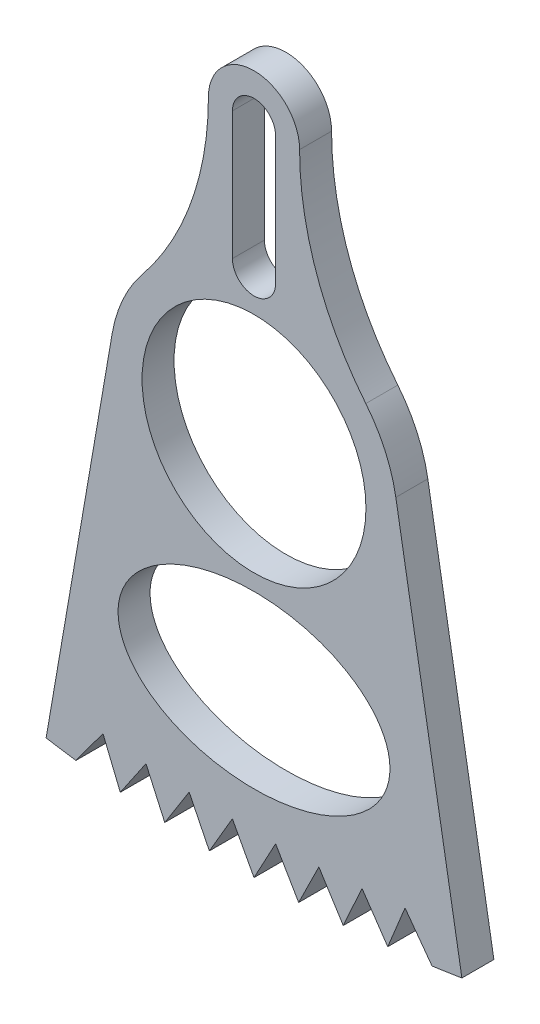
ISO-10303-21;
HEADER;
FILE_DESCRIPTION(('STEP AP214'),'2;1');
FILE_NAME('part.step','',(''),(''),'','','');
FILE_SCHEMA(('AUTOMOTIVE_DESIGN { 1 0 10303 214 1 1 1 1 }'));
ENDSEC;
DATA;
#1=APPLICATION_CONTEXT('core data for automotive mechanical design processes');
#2=APPLICATION_PROTOCOL_DEFINITION('international standard','automotive_design',2000,#1);
#3=PRODUCT_CONTEXT('',#1,'mechanical');
#4=PRODUCT('Part','Part','',(#3));
#5=PRODUCT_RELATED_PRODUCT_CATEGORY('part','',(#4));
#6=PRODUCT_DEFINITION_FORMATION('','',#4);
#7=PRODUCT_DEFINITION_CONTEXT('part definition',#1,'design');
#8=PRODUCT_DEFINITION('design','',#6,#7);
#9=PRODUCT_DEFINITION_SHAPE('','',#8);
#10=(LENGTH_UNIT() NAMED_UNIT(*) SI_UNIT(.MILLI.,.METRE.));
#11=(NAMED_UNIT(*) PLANE_ANGLE_UNIT() SI_UNIT($,.RADIAN.));
#12=(NAMED_UNIT(*) SI_UNIT($,.STERADIAN.) SOLID_ANGLE_UNIT());
#13=UNCERTAINTY_MEASURE_WITH_UNIT(LENGTH_MEASURE(1.E-05),#10,'distance_accuracy_value','');
#14=(GEOMETRIC_REPRESENTATION_CONTEXT(3) GLOBAL_UNCERTAINTY_ASSIGNED_CONTEXT((#13)) GLOBAL_UNIT_ASSIGNED_CONTEXT((#10,
#11,#12)) REPRESENTATION_CONTEXT('',''));
#15=CARTESIAN_POINT('',(0.,0.,0.));
#16=DIRECTION('',(0.,0.,1.));
#17=DIRECTION('',(1.,0.,0.));
#18=AXIS2_PLACEMENT_3D('',#15,#16,#17);
#19=CARTESIAN_POINT('',(0.,56.5,-1.));
#20=DIRECTION('',(0.,0.,1.));
#21=DIRECTION('',(1.,0.,0.));
#22=AXIS2_PLACEMENT_3D('',#19,#20,#21);
#23=CYLINDRICAL_SURFACE('',#22,80.);
#24=DIRECTION('',(0.,0.,1.));
#25=VECTOR('',#24,1.);
#26=CARTESIAN_POINT('',(11.1338480768054,-22.7214454993256,-1.));
#27=LINE('',#26,#25);
#28=CARTESIAN_POINT('',(11.1338480768054,-22.7214454993256,-1.));
#29=VERTEX_POINT('',#28);
#30=CARTESIAN_POINT('',(11.1338480768054,-22.7214454993256,1.));
#31=VERTEX_POINT('',#30);
#32=EDGE_CURVE('E384',#29,#31,#27,.T.);
#33=ORIENTED_EDGE('',*,*,#32,.F.);
#34=CARTESIAN_POINT('',(0.,56.5,-1.));
#35=DIRECTION('',(0.,0.,1.));
#36=DIRECTION('',(1.,0.,0.));
#37=AXIS2_PLACEMENT_3D('',#34,#35,#36);
#38=CIRCLE('',#37,80.);
#39=CARTESIAN_POINT('',(13.,-22.4366834874635,-1.));
#40=VERTEX_POINT('',#39);
#41=EDGE_CURVE('E545',#29,#40,#38,.T.);
#42=ORIENTED_EDGE('',*,*,#41,.T.);
#43=DIRECTION('',(0.,0.,1.));
#44=VECTOR('',#43,1.);
#45=CARTESIAN_POINT('',(13.,-22.4366834874635,-1.));
#46=LINE('',#45,#44);
#47=CARTESIAN_POINT('',(13.,-22.4366834874635,1.));
#48=VERTEX_POINT('',#47);
#49=EDGE_CURVE('E155',#40,#48,#46,.T.);
#50=ORIENTED_EDGE('',*,*,#49,.T.);
#51=CARTESIAN_POINT('',(0.,56.5,1.));
#52=DIRECTION('',(0.,0.,1.));
#53=DIRECTION('',(1.,0.,0.));
#54=AXIS2_PLACEMENT_3D('',#51,#52,#53);
#55=CIRCLE('',#54,80.);
#56=EDGE_CURVE('E583',#31,#48,#55,.T.);
#57=ORIENTED_EDGE('',*,*,#56,.F.);
#58=EDGE_LOOP('',(#33,#42,#50,#57));
#59=FACE_BOUND('',#58,.T.);
#60=ADVANCED_FACE('F151',(#59),#23,.T.);
#61=CARTESIAN_POINT('',(0.,56.5,-1.));
#62=DIRECTION('',(0.,0.,1.));
#63=DIRECTION('',(1.,0.,0.));
#64=AXIS2_PLACEMENT_3D('',#61,#62,#63);
#65=PLANE('',#64);
#66=CARTESIAN_POINT('',(0.,-13.35,-1.));
#67=DIRECTION('',(0.,0.,1.));
#68=DIRECTION('',(-1.,0.,0.));
#69=AXIS2_PLACEMENT_3D('',#66,#67,#68);
#70=ELLIPSE('',#69,8.5,5.35);
#71=CARTESIAN_POINT('',(-8.5,-13.35,-1.));
#72=VERTEX_POINT('',#71);
#73=EDGE_CURVE('E455',#72,#72,#70,.T.);
#74=ORIENTED_EDGE('',*,*,#73,.T.);
#75=EDGE_LOOP('',(#74));
#76=FACE_BOUND('',#75,.T.);
#77=DIRECTION('',(0.,-1.,0.));
#78=VECTOR('',#77,1.);
#79=CARTESIAN_POINT('',(-1.35,9.35,-1.));
#80=LINE('',#79,#78);
#81=CARTESIAN_POINT('',(-1.35,17.35,-1.));
#82=VERTEX_POINT('',#81);
#83=CARTESIAN_POINT('',(-1.35,9.35,-1.));
#84=VERTEX_POINT('',#83);
#85=EDGE_CURVE('E652',#82,#84,#80,.T.);
#86=ORIENTED_EDGE('',*,*,#85,.T.);
#87=CARTESIAN_POINT('',(0.,9.35,-1.));
#88=DIRECTION('',(0.,0.,1.));
#89=DIRECTION('',(1.,0.,0.));
#90=AXIS2_PLACEMENT_3D('',#87,#88,#89);
#91=CIRCLE('',#90,1.35);
#92=CARTESIAN_POINT('',(1.35,9.35,-1.));
#93=VERTEX_POINT('',#92);
#94=EDGE_CURVE('E664',#84,#93,#91,.T.);
#95=ORIENTED_EDGE('',*,*,#94,.T.);
#96=DIRECTION('',(0.,1.,0.));
#97=VECTOR('',#96,1.);
#98=CARTESIAN_POINT('',(1.35,9.35,-1.));
#99=LINE('',#98,#97);
#100=CARTESIAN_POINT('',(1.35,17.35,-1.));
#101=VERTEX_POINT('',#100);
#102=EDGE_CURVE('E682',#93,#101,#99,.T.);
#103=ORIENTED_EDGE('',*,*,#102,.T.);
#104=CARTESIAN_POINT('',(0.,17.35,-1.));
#105=DIRECTION('',(0.,0.,1.));
#106=DIRECTION('',(1.,0.,0.));
#107=AXIS2_PLACEMENT_3D('',#104,#105,#106);
#108=CIRCLE('',#107,1.35);
#109=EDGE_CURVE('E678',#101,#82,#108,.T.);
#110=ORIENTED_EDGE('',*,*,#109,.T.);
#111=EDGE_LOOP('',(#86,#95,#103,#110));
#112=FACE_BOUND('',#111,.T.);
#113=CARTESIAN_POINT('',(0.,0.,-1.));
#114=DIRECTION('',(0.,0.,1.));
#115=DIRECTION('',(1.,0.,0.));
#116=AXIS2_PLACEMENT_3D('',#113,#114,#115);
#117=CIRCLE('',#116,7.);
#118=CARTESIAN_POINT('',(7.,0.,-1.));
#119=VERTEX_POINT('',#118);
#120=EDGE_CURVE('E638',#119,#119,#117,.T.);
#121=ORIENTED_EDGE('',*,*,#120,.T.);
#122=EDGE_LOOP('',(#121));
#123=FACE_BOUND('',#122,.T.);
#124=DIRECTION('',(-0.50449643035438,0.863413777837537,0.));
#125=VECTOR('',#124,1.);
#126=CARTESIAN_POINT('',(-8.13375803337397,-4.75259023950339,-1.));
#127=LINE('',#126,#125);
#128=CARTESIAN_POINT('',(2.79195973620008,-23.4512661615276,-1.));
#129=VERTEX_POINT('',#128);
#130=CARTESIAN_POINT('',(1.35255485266214,-20.9878156125113,-1.));
#131=VERTEX_POINT('',#130);
#132=EDGE_CURVE('E365',#129,#131,#127,.T.);
#133=ORIENTED_EDGE('',*,*,#132,.T.);
#134=DIRECTION('',(-0.474056398467513,-0.880494481000313,0.));
#135=VECTOR('',#134,1.);
#136=CARTESIAN_POINT('',(9.80899499953797,-5.28114251980776,-1.));
#137=LINE('',#136,#135);
#138=CARTESIAN_POINT('',(0.,-23.5,-1.));
#139=VERTEX_POINT('',#138);
#140=EDGE_CURVE('E348',#131,#139,#137,.T.);
#141=ORIENTED_EDGE('',*,*,#140,.T.);
#142=DIRECTION('',(0.474056398467513,-0.880494481000313,0.));
#143=VECTOR('',#142,1.);
#144=CARTESIAN_POINT('',(-9.80899499953797,-5.28114251980776,-1.));
#145=LINE('',#144,#143);
#146=CARTESIAN_POINT('',(-1.35255485266214,-20.9878156125113,-1.));
#147=VERTEX_POINT('',#146);
#148=EDGE_CURVE('E363',#147,#139,#145,.T.);
#149=ORIENTED_EDGE('',*,*,#148,.F.);
#150=DIRECTION('',(0.50449643035438,0.863413777837537,0.));
#151=VECTOR('',#150,1.);
#152=CARTESIAN_POINT('',(8.13375803337397,-4.75259023950339,-1.));
#153=LINE('',#152,#151);
#154=CARTESIAN_POINT('',(-2.79195973620008,-23.4512661615276,-1.));
#155=VERTEX_POINT('',#154);
#156=EDGE_CURVE('E372',#155,#147,#153,.T.);
#157=ORIENTED_EDGE('',*,*,#156,.F.);
#158=DIRECTION('',(0.44303880188191,-0.896502437267764,0.));
#159=VECTOR('',#158,1.);
#160=CARTESIAN_POINT('',(-11.5584441687212,-5.71201933564819,-1.));
#161=LINE('',#160,#159);
#162=CARTESIAN_POINT('',(-4.0560166782436,-20.8934086452704,-1.));
#163=VERTEX_POINT('',#162);
#164=EDGE_CURVE('E438',#163,#155,#161,.T.);
#165=ORIENTED_EDGE('',*,*,#164,.F.);
#166=DIRECTION('',(0.534321811052582,0.845281137985161,0.));
#167=VECTOR('',#166,1.);
#168=CARTESIAN_POINT('',(6.53852816719094,-4.13315529581013,-1.));
#169=LINE('',#168,#167);
#170=CARTESIAN_POINT('',(-5.58051789953006,-23.3051240207859,-1.));
#171=VERTEX_POINT('',#170);
#172=EDGE_CURVE('E435',#171,#163,#169,.T.);
#173=ORIENTED_EDGE('',*,*,#172,.F.);
#174=DIRECTION('',(0.411481430761094,-0.911418143411027,0.));
#175=VECTOR('',#174,1.);
#176=CARTESIAN_POINT('',(-13.3758004505805,-6.03882372407155,-1.));
#177=LINE('',#176,#175);
#178=CARTESIAN_POINT('',(-6.75453687228408,-20.704709731136,-1.));
#179=VERTEX_POINT('',#178);
#180=EDGE_CURVE('E391',#179,#171,#177,.T.);
#181=ORIENTED_EDGE('',*,*,#180,.F.);
#182=DIRECTION('',(0.563496202929981,0.826118653271728,0.));
#183=VECTOR('',#182,1.);
#184=CARTESIAN_POINT('',(5.02856475586009,-3.42998809540578,-1.));
#185=LINE('',#184,#183);
#186=CARTESIAN_POINT('',(-8.36227706141236,-23.0617516294619,-1.));
#187=VERTEX_POINT('',#186);
#188=EDGE_CURVE('E388',#187,#179,#185,.T.);
#189=ORIENTED_EDGE('',*,*,#188,.F.);
#190=DIRECTION('',(0.379422732900757,-0.925223426939743,0.));
#191=VECTOR('',#190,1.);
#192=CARTESIAN_POINT('',(-15.2542765768058,-6.25559096178462,-1.));
#193=LINE('',#192,#191);
#194=CARTESIAN_POINT('',(-9.44482770360232,-20.421948770668,-1.));
#195=VERTEX_POINT('',#194);
#196=EDGE_CURVE('E410',#195,#187,#193,.T.);
#197=ORIENTED_EDGE('',*,*,#196,.F.);
#198=DIRECTION('',(0.591984061484046,0.805949670233107,0.));
#199=VECTOR('',#198,1.);
#200=CARTESIAN_POINT('',(3.60856905014065,-2.65055677959397,-1.));
#201=LINE('',#200,#199);
#202=CARTESIAN_POINT('',(-11.1338480768054,-22.7214454993256,-1.));
#203=VERTEX_POINT('',#202);
#204=EDGE_CURVE('E407',#203,#195,#201,.T.);
#205=ORIENTED_EDGE('',*,*,#204,.F.);
#206=CARTESIAN_POINT('',(-13.,-22.4366834874635,-1.));
#207=VERTEX_POINT('',#206);
#208=EDGE_CURVE('E537',#207,#203,#38,.T.);
#209=ORIENTED_EDGE('',*,*,#208,.F.);
#210=DIRECTION('',(-0.169859659212207,-0.985468262387132,0.));
#211=VECTOR('',#210,1.);
#212=CARTESIAN_POINT('',(-13.,-22.4366834874635,-1.));
#213=LINE('',#212,#211);
#214=CARTESIAN_POINT('',(-8.86921436148419,1.52873693290986,-1.));
#215=VERTEX_POINT('',#214);
#216=EDGE_CURVE('E576',#215,#207,#213,.T.);
#217=ORIENTED_EDGE('',*,*,#216,.F.);
#218=CARTESIAN_POINT('',(0.,0.,-1.));
#219=DIRECTION('',(0.,0.,1.));
#220=DIRECTION('',(1.,0.,0.));
#221=AXIS2_PLACEMENT_3D('',#218,#219,#220);
#222=CIRCLE('',#221,9.00000000000009);
#223=CARTESIAN_POINT('',(-6.99080700615328,5.66821112898224,-1.));
#224=VERTEX_POINT('',#223);
#225=EDGE_CURVE('E572',#224,#215,#222,.T.);
#226=ORIENTED_EDGE('',*,*,#225,.F.);
#227=CARTESIAN_POINT('',(-21.3983739837403,17.3500000000002,-1.));
#228=DIRECTION('',(0.,0.,-1.));
#229=DIRECTION('',(-1.,0.,0.));
#230=AXIS2_PLACEMENT_3D('',#227,#228,#229);
#231=CIRCLE('',#230,18.5483739837403);
#232=CARTESIAN_POINT('',(-2.84999999999999,17.35,-1.));
#233=VERTEX_POINT('',#232);
#234=EDGE_CURVE('E568',#233,#224,#231,.T.);
#235=ORIENTED_EDGE('',*,*,#234,.F.);
#236=CARTESIAN_POINT('',(0.,17.35,-1.));
#237=DIRECTION('',(0.,0.,1.));
#238=DIRECTION('',(1.,0.,0.));
#239=AXIS2_PLACEMENT_3D('',#236,#237,#238);
#240=CIRCLE('',#239,2.85);
#241=CARTESIAN_POINT('',(2.85,17.35,-1.));
#242=VERTEX_POINT('',#241);
#243=EDGE_CURVE('E564',#242,#233,#240,.T.);
#244=ORIENTED_EDGE('',*,*,#243,.F.);
#245=CARTESIAN_POINT('',(21.3983739837402,17.3500000000002,-1.));
#246=DIRECTION('',(0.,0.,-1.));
#247=DIRECTION('',(1.,0.,0.));
#248=AXIS2_PLACEMENT_3D('',#245,#246,#247);
#249=CIRCLE('',#248,18.5483739837403);
#250=CARTESIAN_POINT('',(6.99080700615328,5.66821112898225,-1.));
#251=VERTEX_POINT('',#250);
#252=EDGE_CURVE('E560',#251,#242,#249,.T.);
#253=ORIENTED_EDGE('',*,*,#252,.F.);
#254=CARTESIAN_POINT('',(0.,0.,-1.));
#255=DIRECTION('',(0.,0.,1.));
#256=DIRECTION('',(-1.,0.,0.));
#257=AXIS2_PLACEMENT_3D('',#254,#255,#256);
#258=CIRCLE('',#257,8.99999999999993);
#259=CARTESIAN_POINT('',(8.8692143614842,1.52873693290987,-1.));
#260=VERTEX_POINT('',#259);
#261=EDGE_CURVE('E550',#260,#251,#258,.T.);
#262=ORIENTED_EDGE('',*,*,#261,.F.);
#263=DIRECTION('',(-0.169859659212207,0.985468262387132,0.));
#264=VECTOR('',#263,1.);
#265=CARTESIAN_POINT('',(13.,-22.4366834874635,-1.));
#266=LINE('',#265,#264);
#267=EDGE_CURVE('E544',#40,#260,#266,.T.);
#268=ORIENTED_EDGE('',*,*,#267,.F.);
#269=ORIENTED_EDGE('',*,*,#41,.F.);
#270=DIRECTION('',(-0.591984061484046,0.805949670233107,0.));
#271=VECTOR('',#270,1.);
#272=CARTESIAN_POINT('',(-3.60856905014065,-2.65055677959397,-1.));
#273=LINE('',#272,#271);
#274=CARTESIAN_POINT('',(9.44482770360232,-20.421948770668,-1.));
#275=VERTEX_POINT('',#274);
#276=EDGE_CURVE('E713',#29,#275,#273,.T.);
#277=ORIENTED_EDGE('',*,*,#276,.T.);
#278=DIRECTION('',(-0.379422732900757,-0.925223426939743,0.));
#279=VECTOR('',#278,1.);
#280=CARTESIAN_POINT('',(15.2542765768058,-6.25559096178462,-1.));
#281=LINE('',#280,#279);
#282=CARTESIAN_POINT('',(8.36227706141236,-23.0617516294619,-1.));
#283=VERTEX_POINT('',#282);
#284=EDGE_CURVE('E716',#275,#283,#281,.T.);
#285=ORIENTED_EDGE('',*,*,#284,.T.);
#286=DIRECTION('',(-0.563496202929981,0.826118653271728,0.));
#287=VECTOR('',#286,1.);
#288=CARTESIAN_POINT('',(-5.02856475586009,-3.42998809540578,-1.));
#289=LINE('',#288,#287);
#290=CARTESIAN_POINT('',(6.75453687228408,-20.704709731136,-1.));
#291=VERTEX_POINT('',#290);
#292=EDGE_CURVE('E762',#283,#291,#289,.T.);
#293=ORIENTED_EDGE('',*,*,#292,.T.);
#294=DIRECTION('',(-0.411481430761094,-0.911418143411027,0.));
#295=VECTOR('',#294,1.);
#296=CARTESIAN_POINT('',(13.3758004505805,-6.03882372407155,-1.));
#297=LINE('',#296,#295);
#298=CARTESIAN_POINT('',(5.58051789953006,-23.3051240207859,-1.));
#299=VERTEX_POINT('',#298);
#300=EDGE_CURVE('E766',#291,#299,#297,.T.);
#301=ORIENTED_EDGE('',*,*,#300,.T.);
#302=DIRECTION('',(-0.534321811052582,0.845281137985161,0.));
#303=VECTOR('',#302,1.);
#304=CARTESIAN_POINT('',(-6.53852816719094,-4.13315529581013,-1.));
#305=LINE('',#304,#303);
#306=CARTESIAN_POINT('',(4.0560166782436,-20.8934086452704,-1.));
#307=VERTEX_POINT('',#306);
#308=EDGE_CURVE('E727',#299,#307,#305,.T.);
#309=ORIENTED_EDGE('',*,*,#308,.T.);
#310=DIRECTION('',(-0.44303880188191,-0.896502437267764,0.));
#311=VECTOR('',#310,1.);
#312=CARTESIAN_POINT('',(11.5584441687212,-5.71201933564819,-1.));
#313=LINE('',#312,#311);
#314=EDGE_CURVE('E731',#307,#129,#313,.T.);
#315=ORIENTED_EDGE('',*,*,#314,.T.);
#316=EDGE_LOOP('',(#133,#141,#149,#157,#165,#173,#181,#189,#197,#205,#209,#217,#226,#235,#244,
#253,#262,#268,#269,#277,#285,#293,#301,#309,#315));
#317=FACE_BOUND('',#316,.T.);
#318=ADVANCED_FACE('F361',(#76,#112,#123,#317),#65,.F.);
#319=CARTESIAN_POINT('',(0.,56.5,1.));
#320=DIRECTION('',(0.,0.,1.));
#321=DIRECTION('',(1.,0.,0.));
#322=AXIS2_PLACEMENT_3D('',#319,#320,#321);
#323=PLANE('',#322);
#324=DIRECTION('',(-0.474056398467513,-0.880494481000313,0.));
#325=VECTOR('',#324,1.);
#326=CARTESIAN_POINT('',(9.80899499953797,-5.28114251980776,1.));
#327=LINE('',#326,#325);
#328=CARTESIAN_POINT('',(1.35255485266214,-20.9878156125113,1.));
#329=VERTEX_POINT('',#328);
#330=CARTESIAN_POINT('',(0.,-23.5,1.));
#331=VERTEX_POINT('',#330);
#332=EDGE_CURVE('E351',#329,#331,#327,.T.);
#333=ORIENTED_EDGE('',*,*,#332,.F.);
#334=DIRECTION('',(-0.50449643035438,0.863413777837537,0.));
#335=VECTOR('',#334,1.);
#336=CARTESIAN_POINT('',(-8.13375803337397,-4.75259023950339,1.));
#337=LINE('',#336,#335);
#338=CARTESIAN_POINT('',(2.79195973620008,-23.4512661615276,1.));
#339=VERTEX_POINT('',#338);
#340=EDGE_CURVE('E367',#339,#329,#337,.T.);
#341=ORIENTED_EDGE('',*,*,#340,.F.);
#342=DIRECTION('',(-0.44303880188191,-0.896502437267764,0.));
#343=VECTOR('',#342,1.);
#344=CARTESIAN_POINT('',(11.5584441687212,-5.71201933564819,1.));
#345=LINE('',#344,#343);
#346=CARTESIAN_POINT('',(4.0560166782436,-20.8934086452704,1.));
#347=VERTEX_POINT('',#346);
#348=EDGE_CURVE('E732',#347,#339,#345,.T.);
#349=ORIENTED_EDGE('',*,*,#348,.F.);
#350=DIRECTION('',(-0.534321811052582,0.845281137985161,0.));
#351=VECTOR('',#350,1.);
#352=CARTESIAN_POINT('',(-6.53852816719094,-4.13315529581013,1.));
#353=LINE('',#352,#351);
#354=CARTESIAN_POINT('',(5.58051789953006,-23.3051240207859,1.));
#355=VERTEX_POINT('',#354);
#356=EDGE_CURVE('E735',#355,#347,#353,.T.);
#357=ORIENTED_EDGE('',*,*,#356,.F.);
#358=DIRECTION('',(-0.411481430761094,-0.911418143411027,0.));
#359=VECTOR('',#358,1.);
#360=CARTESIAN_POINT('',(13.3758004505805,-6.03882372407155,1.));
#361=LINE('',#360,#359);
#362=CARTESIAN_POINT('',(6.75453687228408,-20.704709731136,1.));
#363=VERTEX_POINT('',#362);
#364=EDGE_CURVE('E767',#363,#355,#361,.T.);
#365=ORIENTED_EDGE('',*,*,#364,.F.);
#366=DIRECTION('',(-0.563496202929981,0.826118653271728,0.));
#367=VECTOR('',#366,1.);
#368=CARTESIAN_POINT('',(-5.02856475586009,-3.42998809540578,1.));
#369=LINE('',#368,#367);
#370=CARTESIAN_POINT('',(8.36227706141236,-23.0617516294619,1.));
#371=VERTEX_POINT('',#370);
#372=EDGE_CURVE('E761',#371,#363,#369,.T.);
#373=ORIENTED_EDGE('',*,*,#372,.F.);
#374=DIRECTION('',(-0.379422732900757,-0.925223426939743,0.));
#375=VECTOR('',#374,1.);
#376=CARTESIAN_POINT('',(15.2542765768058,-6.25559096178462,1.));
#377=LINE('',#376,#375);
#378=CARTESIAN_POINT('',(9.44482770360232,-20.421948770668,1.));
#379=VERTEX_POINT('',#378);
#380=EDGE_CURVE('E706',#379,#371,#377,.T.);
#381=ORIENTED_EDGE('',*,*,#380,.F.);
#382=DIRECTION('',(-0.591984061484046,0.805949670233107,0.));
#383=VECTOR('',#382,1.);
#384=CARTESIAN_POINT('',(-3.60856905014065,-2.65055677959397,1.));
#385=LINE('',#384,#383);
#386=EDGE_CURVE('E636',#31,#379,#385,.T.);
#387=ORIENTED_EDGE('',*,*,#386,.F.);
#388=ORIENTED_EDGE('',*,*,#56,.T.);
#389=DIRECTION('',(-0.169859659212207,0.985468262387132,0.));
#390=VECTOR('',#389,1.);
#391=CARTESIAN_POINT('',(13.,-22.4366834874635,1.));
#392=LINE('',#391,#390);
#393=CARTESIAN_POINT('',(8.8692143614842,1.52873693290987,1.));
#394=VERTEX_POINT('',#393);
#395=EDGE_CURVE('E582',#48,#394,#392,.T.);
#396=ORIENTED_EDGE('',*,*,#395,.T.);
#397=CARTESIAN_POINT('',(0.,0.,1.));
#398=DIRECTION('',(0.,0.,1.));
#399=DIRECTION('',(-1.,0.,0.));
#400=AXIS2_PLACEMENT_3D('',#397,#398,#399);
#401=CIRCLE('',#400,8.99999999999993);
#402=CARTESIAN_POINT('',(6.99080700615328,5.66821112898225,1.));
#403=VERTEX_POINT('',#402);
#404=EDGE_CURVE('E587',#394,#403,#401,.T.);
#405=ORIENTED_EDGE('',*,*,#404,.T.);
#406=CARTESIAN_POINT('',(21.3983739837402,17.3500000000002,1.));
#407=DIRECTION('',(0.,0.,-1.));
#408=DIRECTION('',(1.,0.,0.));
#409=AXIS2_PLACEMENT_3D('',#406,#407,#408);
#410=CIRCLE('',#409,18.5483739837403);
#411=CARTESIAN_POINT('',(2.85,17.35,1.));
#412=VERTEX_POINT('',#411);
#413=EDGE_CURVE('E591',#403,#412,#410,.T.);
#414=ORIENTED_EDGE('',*,*,#413,.T.);
#415=CARTESIAN_POINT('',(0.,17.35,1.));
#416=DIRECTION('',(0.,0.,1.));
#417=DIRECTION('',(1.,0.,0.));
#418=AXIS2_PLACEMENT_3D('',#415,#416,#417);
#419=CIRCLE('',#418,2.85);
#420=CARTESIAN_POINT('',(-2.84999999999999,17.35,1.));
#421=VERTEX_POINT('',#420);
#422=EDGE_CURVE('E595',#412,#421,#419,.T.);
#423=ORIENTED_EDGE('',*,*,#422,.T.);
#424=CARTESIAN_POINT('',(-21.3983739837403,17.3500000000002,1.));
#425=DIRECTION('',(0.,0.,-1.));
#426=DIRECTION('',(-1.,0.,0.));
#427=AXIS2_PLACEMENT_3D('',#424,#425,#426);
#428=CIRCLE('',#427,18.5483739837403);
#429=CARTESIAN_POINT('',(-6.99080700615328,5.66821112898224,1.));
#430=VERTEX_POINT('',#429);
#431=EDGE_CURVE('E599',#421,#430,#428,.T.);
#432=ORIENTED_EDGE('',*,*,#431,.T.);
#433=CARTESIAN_POINT('',(0.,0.,1.));
#434=DIRECTION('',(0.,0.,1.));
#435=DIRECTION('',(1.,0.,0.));
#436=AXIS2_PLACEMENT_3D('',#433,#434,#435);
#437=CIRCLE('',#436,9.00000000000009);
#438=CARTESIAN_POINT('',(-8.86921436148419,1.52873693290986,1.));
#439=VERTEX_POINT('',#438);
#440=EDGE_CURVE('E603',#430,#439,#437,.T.);
#441=ORIENTED_EDGE('',*,*,#440,.T.);
#442=DIRECTION('',(-0.169859659212207,-0.985468262387132,0.));
#443=VECTOR('',#442,1.);
#444=CARTESIAN_POINT('',(-13.,-22.4366834874635,1.));
#445=LINE('',#444,#443);
#446=CARTESIAN_POINT('',(-13.,-22.4366834874635,1.));
#447=VERTEX_POINT('',#446);
#448=EDGE_CURVE('E552',#439,#447,#445,.T.);
#449=ORIENTED_EDGE('',*,*,#448,.T.);
#450=CARTESIAN_POINT('',(-11.1338480768054,-22.7214454993256,1.));
#451=VERTEX_POINT('',#450);
#452=EDGE_CURVE('E579',#447,#451,#55,.T.);
#453=ORIENTED_EDGE('',*,*,#452,.T.);
#454=DIRECTION('',(0.591984061484046,0.805949670233107,0.));
#455=VECTOR('',#454,1.);
#456=CARTESIAN_POINT('',(3.60856905014065,-2.65055677959397,1.));
#457=LINE('',#456,#455);
#458=CARTESIAN_POINT('',(-9.44482770360232,-20.421948770668,1.));
#459=VERTEX_POINT('',#458);
#460=EDGE_CURVE('E416',#451,#459,#457,.T.);
#461=ORIENTED_EDGE('',*,*,#460,.T.);
#462=DIRECTION('',(0.379422732900757,-0.925223426939743,0.));
#463=VECTOR('',#462,1.);
#464=CARTESIAN_POINT('',(-15.2542765768058,-6.25559096178462,1.));
#465=LINE('',#464,#463);
#466=CARTESIAN_POINT('',(-8.36227706141236,-23.0617516294618,1.));
#467=VERTEX_POINT('',#466);
#468=EDGE_CURVE('E411',#459,#467,#465,.T.);
#469=ORIENTED_EDGE('',*,*,#468,.T.);
#470=DIRECTION('',(0.563496202929981,0.826118653271728,0.));
#471=VECTOR('',#470,1.);
#472=CARTESIAN_POINT('',(5.02856475586009,-3.42998809540578,1.));
#473=LINE('',#472,#471);
#474=CARTESIAN_POINT('',(-6.75453687228408,-20.704709731136,1.));
#475=VERTEX_POINT('',#474);
#476=EDGE_CURVE('E177',#467,#475,#473,.T.);
#477=ORIENTED_EDGE('',*,*,#476,.T.);
#478=DIRECTION('',(0.411481430761094,-0.911418143411027,0.));
#479=VECTOR('',#478,1.);
#480=CARTESIAN_POINT('',(-13.3758004505805,-6.03882372407155,1.));
#481=LINE('',#480,#479);
#482=CARTESIAN_POINT('',(-5.58051789953006,-23.3051240207859,1.));
#483=VERTEX_POINT('',#482);
#484=EDGE_CURVE('E392',#475,#483,#481,.T.);
#485=ORIENTED_EDGE('',*,*,#484,.T.);
#486=DIRECTION('',(0.534321811052582,0.845281137985161,0.));
#487=VECTOR('',#486,1.);
#488=CARTESIAN_POINT('',(6.53852816719094,-4.13315529581013,1.));
#489=LINE('',#488,#487);
#490=CARTESIAN_POINT('',(-4.0560166782436,-20.8934086452704,1.));
#491=VERTEX_POINT('',#490);
#492=EDGE_CURVE('E404',#483,#491,#489,.T.);
#493=ORIENTED_EDGE('',*,*,#492,.T.);
#494=DIRECTION('',(0.44303880188191,-0.896502437267764,0.));
#495=VECTOR('',#494,1.);
#496=CARTESIAN_POINT('',(-11.5584441687212,-5.71201933564819,1.));
#497=LINE('',#496,#495);
#498=CARTESIAN_POINT('',(-2.79195973620008,-23.4512661615277,1.));
#499=VERTEX_POINT('',#498);
#500=EDGE_CURVE('E439',#491,#499,#497,.T.);
#501=ORIENTED_EDGE('',*,*,#500,.T.);
#502=DIRECTION('',(0.50449643035438,0.863413777837537,0.));
#503=VECTOR('',#502,1.);
#504=CARTESIAN_POINT('',(8.13375803337397,-4.75259023950339,1.));
#505=LINE('',#504,#503);
#506=CARTESIAN_POINT('',(-1.35255485266214,-20.9878156125113,1.));
#507=VERTEX_POINT('',#506);
#508=EDGE_CURVE('E169',#499,#507,#505,.T.);
#509=ORIENTED_EDGE('',*,*,#508,.T.);
#510=DIRECTION('',(0.474056398467513,-0.880494481000313,0.));
#511=VECTOR('',#510,1.);
#512=CARTESIAN_POINT('',(-9.80899499953797,-5.28114251980776,1.));
#513=LINE('',#512,#511);
#514=EDGE_CURVE('E377',#507,#331,#513,.T.);
#515=ORIENTED_EDGE('',*,*,#514,.T.);
#516=EDGE_LOOP('',(#333,#341,#349,#357,#365,#373,#381,#387,#388,#396,#405,#414,#423,#432,#441,
#449,#453,#461,#469,#477,#485,#493,#501,#509,#515));
#517=FACE_BOUND('',#516,.T.);
#518=CARTESIAN_POINT('',(0.,-13.35,1.));
#519=DIRECTION('',(0.,0.,1.));
#520=DIRECTION('',(-1.,0.,0.));
#521=AXIS2_PLACEMENT_3D('',#518,#519,#520);
#522=ELLIPSE('',#521,8.5,5.35);
#523=CARTESIAN_POINT('',(-8.5,-13.35,1.));
#524=VERTEX_POINT('',#523);
#525=EDGE_CURVE('E428',#524,#524,#522,.T.);
#526=ORIENTED_EDGE('',*,*,#525,.F.);
#527=EDGE_LOOP('',(#526));
#528=FACE_BOUND('',#527,.T.);
#529=CARTESIAN_POINT('',(0.,9.35,1.));
#530=DIRECTION('',(0.,0.,1.));
#531=DIRECTION('',(1.,0.,0.));
#532=AXIS2_PLACEMENT_3D('',#529,#530,#531);
#533=CIRCLE('',#532,1.35);
#534=CARTESIAN_POINT('',(-1.35,9.35,1.));
#535=VERTEX_POINT('',#534);
#536=CARTESIAN_POINT('',(1.35,9.35,1.));
#537=VERTEX_POINT('',#536);
#538=EDGE_CURVE('E460',#535,#537,#533,.T.);
#539=ORIENTED_EDGE('',*,*,#538,.F.);
#540=DIRECTION('',(0.,-1.,0.));
#541=VECTOR('',#540,1.);
#542=CARTESIAN_POINT('',(-1.35,9.35,1.));
#543=LINE('',#542,#541);
#544=CARTESIAN_POINT('',(-1.35,17.35,1.));
#545=VERTEX_POINT('',#544);
#546=EDGE_CURVE('E660',#545,#535,#543,.T.);
#547=ORIENTED_EDGE('',*,*,#546,.F.);
#548=CARTESIAN_POINT('',(0.,17.35,1.));
#549=DIRECTION('',(0.,0.,1.));
#550=DIRECTION('',(1.,0.,0.));
#551=AXIS2_PLACEMENT_3D('',#548,#549,#550);
#552=CIRCLE('',#551,1.35);
#553=CARTESIAN_POINT('',(1.35,17.35,1.));
#554=VERTEX_POINT('',#553);
#555=EDGE_CURVE('E665',#554,#545,#552,.T.);
#556=ORIENTED_EDGE('',*,*,#555,.F.);
#557=DIRECTION('',(0.,1.,0.));
#558=VECTOR('',#557,1.);
#559=CARTESIAN_POINT('',(1.35,9.35,1.));
#560=LINE('',#559,#558);
#561=EDGE_CURVE('E669',#537,#554,#560,.T.);
#562=ORIENTED_EDGE('',*,*,#561,.F.);
#563=EDGE_LOOP('',(#539,#547,#556,#562));
#564=FACE_BOUND('',#563,.T.);
#565=CARTESIAN_POINT('',(0.,0.,1.));
#566=DIRECTION('',(0.,0.,1.));
#567=DIRECTION('',(1.,0.,0.));
#568=AXIS2_PLACEMENT_3D('',#565,#566,#567);
#569=CIRCLE('',#568,7.);
#570=CARTESIAN_POINT('',(7.,0.,1.));
#571=VERTEX_POINT('',#570);
#572=EDGE_CURVE('E554',#571,#571,#569,.T.);
#573=ORIENTED_EDGE('',*,*,#572,.F.);
#574=EDGE_LOOP('',(#573));
#575=FACE_BOUND('',#574,.T.);
#576=ADVANCED_FACE('F493',(#517,#528,#564,#575),#323,.T.);
#577=ORIENTED_EDGE('',*,*,#208,.T.);
#578=DIRECTION('',(0.,0.,1.));
#579=VECTOR('',#578,1.);
#580=CARTESIAN_POINT('',(-11.1338480768054,-22.7214454993256,-1.));
#581=LINE('',#580,#579);
#582=EDGE_CURVE('E415',#203,#451,#581,.T.);
#583=ORIENTED_EDGE('',*,*,#582,.T.);
#584=ORIENTED_EDGE('',*,*,#452,.F.);
#585=DIRECTION('',(0.,0.,1.));
#586=VECTOR('',#585,1.);
#587=CARTESIAN_POINT('',(-13.,-22.4366834874635,-1.));
#588=LINE('',#587,#586);
#589=EDGE_CURVE('E12',#207,#447,#588,.T.);
#590=ORIENTED_EDGE('',*,*,#589,.F.);
#591=EDGE_LOOP('',(#577,#583,#584,#590));
#592=FACE_BOUND('',#591,.T.);
#593=ADVANCED_FACE('F153',(#592),#23,.T.);
#594=CARTESIAN_POINT('',(-13.,-22.4366834874635,-1.));
#595=DIRECTION('',(-0.985468262387132,0.169859659212207,0.));
#596=DIRECTION('',(-0.169859659212207,-0.985468262387132,0.));
#597=AXIS2_PLACEMENT_3D('',#594,#595,#596);
#598=PLANE('',#597);
#599=ORIENTED_EDGE('',*,*,#448,.F.);
#600=DIRECTION('',(0.,0.,1.));
#601=VECTOR('',#600,1.);
#602=CARTESIAN_POINT('',(-8.86921436148419,1.52873693290986,-1.));
#603=LINE('',#602,#601);
#604=EDGE_CURVE('E161',#215,#439,#603,.T.);
#605=ORIENTED_EDGE('',*,*,#604,.F.);
#606=ORIENTED_EDGE('',*,*,#216,.T.);
#607=ORIENTED_EDGE('',*,*,#589,.T.);
#608=EDGE_LOOP('',(#599,#605,#606,#607));
#609=FACE_BOUND('',#608,.T.);
#610=ADVANCED_FACE('F498',(#609),#598,.T.);
#611=CARTESIAN_POINT('',(0.,0.,-1.));
#612=DIRECTION('',(0.,0.,1.));
#613=DIRECTION('',(1.,0.,0.));
#614=AXIS2_PLACEMENT_3D('',#611,#612,#613);
#615=CYLINDRICAL_SURFACE('',#614,9.00000000000009);
#616=ORIENTED_EDGE('',*,*,#440,.F.);
#617=DIRECTION('',(0.,0.,1.));
#618=VECTOR('',#617,1.);
#619=CARTESIAN_POINT('',(-6.99080700615328,5.66821112898224,-1.));
#620=LINE('',#619,#618);
#621=EDGE_CURVE('E612',#224,#430,#620,.T.);
#622=ORIENTED_EDGE('',*,*,#621,.F.);
#623=ORIENTED_EDGE('',*,*,#225,.T.);
#624=ORIENTED_EDGE('',*,*,#604,.T.);
#625=EDGE_LOOP('',(#616,#622,#623,#624));
#626=FACE_BOUND('',#625,.T.);
#627=ADVANCED_FACE('F501',(#626),#615,.T.);
#628=CARTESIAN_POINT('',(-21.3983739837403,17.3500000000002,-1.));
#629=DIRECTION('',(0.,0.,1.));
#630=DIRECTION('',(1.,0.,0.));
#631=AXIS2_PLACEMENT_3D('',#628,#629,#630);
#632=CYLINDRICAL_SURFACE('',#631,18.5483739837403);
#633=ORIENTED_EDGE('',*,*,#431,.F.);
#634=DIRECTION('',(0.,0.,1.));
#635=VECTOR('',#634,1.);
#636=CARTESIAN_POINT('',(-2.84999999999999,17.35,-1.));
#637=LINE('',#636,#635);
#638=EDGE_CURVE('E615',#233,#421,#637,.T.);
#639=ORIENTED_EDGE('',*,*,#638,.F.);
#640=ORIENTED_EDGE('',*,*,#234,.T.);
#641=ORIENTED_EDGE('',*,*,#621,.T.);
#642=EDGE_LOOP('',(#633,#639,#640,#641));
#643=FACE_BOUND('',#642,.T.);
#644=ADVANCED_FACE('F505',(#643),#632,.F.);
#645=CARTESIAN_POINT('',(0.,17.35,-1.));
#646=DIRECTION('',(0.,0.,1.));
#647=DIRECTION('',(1.,0.,0.));
#648=AXIS2_PLACEMENT_3D('',#645,#646,#647);
#649=CYLINDRICAL_SURFACE('',#648,2.85);
#650=ORIENTED_EDGE('',*,*,#422,.F.);
#651=DIRECTION('',(0.,0.,1.));
#652=VECTOR('',#651,1.);
#653=CARTESIAN_POINT('',(2.85,17.35,-1.));
#654=LINE('',#653,#652);
#655=EDGE_CURVE('E618',#242,#412,#654,.T.);
#656=ORIENTED_EDGE('',*,*,#655,.F.);
#657=ORIENTED_EDGE('',*,*,#243,.T.);
#658=ORIENTED_EDGE('',*,*,#638,.T.);
#659=EDGE_LOOP('',(#650,#656,#657,#658));
#660=FACE_BOUND('',#659,.T.);
#661=ADVANCED_FACE('F509',(#660),#649,.T.);
#662=CARTESIAN_POINT('',(21.3983739837402,17.3500000000002,-1.));
#663=DIRECTION('',(0.,0.,1.));
#664=DIRECTION('',(1.,0.,0.));
#665=AXIS2_PLACEMENT_3D('',#662,#663,#664);
#666=CYLINDRICAL_SURFACE('',#665,18.5483739837403);
#667=ORIENTED_EDGE('',*,*,#413,.F.);
#668=DIRECTION('',(0.,0.,1.));
#669=VECTOR('',#668,1.);
#670=CARTESIAN_POINT('',(6.99080700615328,5.66821112898225,-1.));
#671=LINE('',#670,#669);
#672=EDGE_CURVE('E621',#251,#403,#671,.T.);
#673=ORIENTED_EDGE('',*,*,#672,.F.);
#674=ORIENTED_EDGE('',*,*,#252,.T.);
#675=ORIENTED_EDGE('',*,*,#655,.T.);
#676=EDGE_LOOP('',(#667,#673,#674,#675));
#677=FACE_BOUND('',#676,.T.);
#678=ADVANCED_FACE('F513',(#677),#666,.F.);
#679=CARTESIAN_POINT('',(0.,0.,-1.));
#680=DIRECTION('',(0.,0.,1.));
#681=DIRECTION('',(1.,0.,0.));
#682=AXIS2_PLACEMENT_3D('',#679,#680,#681);
#683=CYLINDRICAL_SURFACE('',#682,8.99999999999993);
#684=ORIENTED_EDGE('',*,*,#404,.F.);
#685=DIRECTION('',(0.,0.,1.));
#686=VECTOR('',#685,1.);
#687=CARTESIAN_POINT('',(8.8692143614842,1.52873693290987,-1.));
#688=LINE('',#687,#686);
#689=EDGE_CURVE('E623',#260,#394,#688,.T.);
#690=ORIENTED_EDGE('',*,*,#689,.F.);
#691=ORIENTED_EDGE('',*,*,#261,.T.);
#692=ORIENTED_EDGE('',*,*,#672,.T.);
#693=EDGE_LOOP('',(#684,#690,#691,#692));
#694=FACE_BOUND('',#693,.T.);
#695=ADVANCED_FACE('F517',(#694),#683,.T.);
#696=CARTESIAN_POINT('',(13.,-22.4366834874635,-1.));
#697=DIRECTION('',(0.985468262387132,0.169859659212207,0.));
#698=DIRECTION('',(-0.169859659212207,0.985468262387132,0.));
#699=AXIS2_PLACEMENT_3D('',#696,#697,#698);
#700=PLANE('',#699);
#701=ORIENTED_EDGE('',*,*,#395,.F.);
#702=ORIENTED_EDGE('',*,*,#49,.F.);
#703=ORIENTED_EDGE('',*,*,#267,.T.);
#704=ORIENTED_EDGE('',*,*,#689,.T.);
#705=EDGE_LOOP('',(#701,#702,#703,#704));
#706=FACE_BOUND('',#705,.T.);
#707=ADVANCED_FACE('F489',(#706),#700,.T.);
#708=CARTESIAN_POINT('',(0.,0.,-1.));
#709=DIRECTION('',(0.,0.,1.));
#710=DIRECTION('',(1.,0.,0.));
#711=AXIS2_PLACEMENT_3D('',#708,#709,#710);
#712=CYLINDRICAL_SURFACE('',#711,7.);
#713=ORIENTED_EDGE('',*,*,#120,.F.);
#714=EDGE_LOOP('',(#713));
#715=FACE_BOUND('',#714,.T.);
#716=ORIENTED_EDGE('',*,*,#572,.T.);
#717=EDGE_LOOP('',(#716));
#718=FACE_BOUND('',#717,.T.);
#719=ADVANCED_FACE('F485',(#715,#718),#712,.F.);
#720=CARTESIAN_POINT('',(0.,9.35,-1.));
#721=DIRECTION('',(0.,0.,1.));
#722=DIRECTION('',(1.,0.,0.));
#723=AXIS2_PLACEMENT_3D('',#720,#721,#722);
#724=CYLINDRICAL_SURFACE('',#723,1.35);
#725=ORIENTED_EDGE('',*,*,#538,.T.);
#726=DIRECTION('',(0.,0.,1.));
#727=VECTOR('',#726,1.);
#728=CARTESIAN_POINT('',(1.35,9.35,-1.));
#729=LINE('',#728,#727);
#730=EDGE_CURVE('E647',#93,#537,#729,.T.);
#731=ORIENTED_EDGE('',*,*,#730,.F.);
#732=ORIENTED_EDGE('',*,*,#94,.F.);
#733=DIRECTION('',(0.,0.,1.));
#734=VECTOR('',#733,1.);
#735=CARTESIAN_POINT('',(-1.35,9.35,-1.));
#736=LINE('',#735,#734);
#737=EDGE_CURVE('E645',#84,#535,#736,.T.);
#738=ORIENTED_EDGE('',*,*,#737,.T.);
#739=EDGE_LOOP('',(#725,#731,#732,#738));
#740=FACE_BOUND('',#739,.T.);
#741=ADVANCED_FACE('F475',(#740),#724,.F.);
#742=CARTESIAN_POINT('',(-1.35,9.35,-1.));
#743=DIRECTION('',(-1.,0.,0.));
#744=DIRECTION('',(0.,0.,1.));
#745=AXIS2_PLACEMENT_3D('',#742,#743,#744);
#746=PLANE('',#745);
#747=ORIENTED_EDGE('',*,*,#546,.T.);
#748=ORIENTED_EDGE('',*,*,#737,.F.);
#749=ORIENTED_EDGE('',*,*,#85,.F.);
#750=DIRECTION('',(0.,0.,1.));
#751=VECTOR('',#750,1.);
#752=CARTESIAN_POINT('',(-1.35,17.35,-1.));
#753=LINE('',#752,#751);
#754=EDGE_CURVE('E655',#82,#545,#753,.T.);
#755=ORIENTED_EDGE('',*,*,#754,.T.);
#756=EDGE_LOOP('',(#747,#748,#749,#755));
#757=FACE_BOUND('',#756,.T.);
#758=ADVANCED_FACE('F471',(#757),#746,.F.);
#759=CARTESIAN_POINT('',(0.,17.35,-1.));
#760=DIRECTION('',(0.,0.,1.));
#761=DIRECTION('',(1.,0.,0.));
#762=AXIS2_PLACEMENT_3D('',#759,#760,#761);
#763=CYLINDRICAL_SURFACE('',#762,1.35);
#764=ORIENTED_EDGE('',*,*,#555,.T.);
#765=ORIENTED_EDGE('',*,*,#754,.F.);
#766=ORIENTED_EDGE('',*,*,#109,.F.);
#767=DIRECTION('',(0.,0.,1.));
#768=VECTOR('',#767,1.);
#769=CARTESIAN_POINT('',(1.35,17.35,-1.));
#770=LINE('',#769,#768);
#771=EDGE_CURVE('E651',#101,#554,#770,.T.);
#772=ORIENTED_EDGE('',*,*,#771,.T.);
#773=EDGE_LOOP('',(#764,#765,#766,#772));
#774=FACE_BOUND('',#773,.T.);
#775=ADVANCED_FACE('F474',(#774),#763,.F.);
#776=CARTESIAN_POINT('',(1.35,9.35,-1.));
#777=DIRECTION('',(1.,0.,0.));
#778=DIRECTION('',(0.,0.,-1.));
#779=AXIS2_PLACEMENT_3D('',#776,#777,#778);
#780=PLANE('',#779);
#781=ORIENTED_EDGE('',*,*,#561,.T.);
#782=ORIENTED_EDGE('',*,*,#771,.F.);
#783=ORIENTED_EDGE('',*,*,#102,.F.);
#784=ORIENTED_EDGE('',*,*,#730,.T.);
#785=EDGE_LOOP('',(#781,#782,#783,#784));
#786=FACE_BOUND('',#785,.T.);
#787=ADVANCED_FACE('F468',(#786),#780,.F.);
#788=DIRECTION('',(0.,0.,1.));
#789=VECTOR('',#788,1.);
#790=SURFACE_OF_LINEAR_EXTRUSION('',#70,#789);
#791=ORIENTED_EDGE('',*,*,#73,.F.);
#792=EDGE_LOOP('',(#791));
#793=FACE_BOUND('',#792,.T.);
#794=ORIENTED_EDGE('',*,*,#525,.T.);
#795=EDGE_LOOP('',(#794));
#796=FACE_BOUND('',#795,.T.);
#797=ADVANCED_FACE('F463',(#793,#796),#790,.F.);
#798=CARTESIAN_POINT('',(6.53852816719094,-4.13315529581013,-1.));
#799=DIRECTION('',(0.845281137985161,-0.534321811052582,0.));
#800=DIRECTION('',(0.534321811052582,0.845281137985161,0.));
#801=AXIS2_PLACEMENT_3D('',#798,#799,#800);
#802=PLANE('',#801);
#803=ORIENTED_EDGE('',*,*,#492,.F.);
#804=DIRECTION('',(0.,0.,1.));
#805=VECTOR('',#804,1.);
#806=CARTESIAN_POINT('',(-5.58051789953006,-23.3051240207859,-1.));
#807=LINE('',#806,#805);
#808=EDGE_CURVE('E395',#171,#483,#807,.T.);
#809=ORIENTED_EDGE('',*,*,#808,.F.);
#810=ORIENTED_EDGE('',*,*,#172,.T.);
#811=DIRECTION('',(0.,0.,1.));
#812=VECTOR('',#811,1.);
#813=CARTESIAN_POINT('',(-4.0560166782436,-20.8934086452704,-1.));
#814=LINE('',#813,#812);
#815=EDGE_CURVE('E420',#163,#491,#814,.T.);
#816=ORIENTED_EDGE('',*,*,#815,.T.);
#817=EDGE_LOOP('',(#803,#809,#810,#816));
#818=FACE_BOUND('',#817,.T.);
#819=ADVANCED_FACE('F467',(#818),#802,.T.);
#820=CARTESIAN_POINT('',(-11.5584441687212,-5.71201933564819,-1.));
#821=DIRECTION('',(-0.896502437267764,-0.44303880188191,0.));
#822=DIRECTION('',(0.44303880188191,-0.896502437267764,0.));
#823=AXIS2_PLACEMENT_3D('',#820,#821,#822);
#824=PLANE('',#823);
#825=ORIENTED_EDGE('',*,*,#500,.F.);
#826=ORIENTED_EDGE('',*,*,#815,.F.);
#827=ORIENTED_EDGE('',*,*,#164,.T.);
#828=DIRECTION('',(0.,0.,1.));
#829=VECTOR('',#828,1.);
#830=CARTESIAN_POINT('',(-2.79195973620008,-23.4512661615276,-1.));
#831=LINE('',#830,#829);
#832=EDGE_CURVE('E443',#155,#499,#831,.T.);
#833=ORIENTED_EDGE('',*,*,#832,.T.);
#834=EDGE_LOOP('',(#825,#826,#827,#833));
#835=FACE_BOUND('',#834,.T.);
#836=ADVANCED_FACE('F825',(#835),#824,.T.);
#837=CARTESIAN_POINT('',(3.60856905014065,-2.65055677959397,-1.));
#838=DIRECTION('',(0.805949670233107,-0.591984061484046,0.));
#839=DIRECTION('',(0.591984061484046,0.805949670233107,0.));
#840=AXIS2_PLACEMENT_3D('',#837,#838,#839);
#841=PLANE('',#840);
#842=ORIENTED_EDGE('',*,*,#460,.F.);
#843=ORIENTED_EDGE('',*,*,#582,.F.);
#844=ORIENTED_EDGE('',*,*,#204,.T.);
#845=DIRECTION('',(0.,0.,1.));
#846=VECTOR('',#845,1.);
#847=CARTESIAN_POINT('',(-9.44482770360232,-20.421948770668,-1.));
#848=LINE('',#847,#846);
#849=EDGE_CURVE('E424',#195,#459,#848,.T.);
#850=ORIENTED_EDGE('',*,*,#849,.T.);
#851=EDGE_LOOP('',(#842,#843,#844,#850));
#852=FACE_BOUND('',#851,.T.);
#853=ADVANCED_FACE('F822',(#852),#841,.T.);
#854=CARTESIAN_POINT('',(-15.2542765768058,-6.25559096178462,-1.));
#855=DIRECTION('',(-0.925223426939742,-0.379422732900757,0.));
#856=DIRECTION('',(0.379422732900757,-0.925223426939742,0.));
#857=AXIS2_PLACEMENT_3D('',#854,#855,#856);
#858=PLANE('',#857);
#859=ORIENTED_EDGE('',*,*,#468,.F.);
#860=ORIENTED_EDGE('',*,*,#849,.F.);
#861=ORIENTED_EDGE('',*,*,#196,.T.);
#862=DIRECTION('',(0.,0.,1.));
#863=VECTOR('',#862,1.);
#864=CARTESIAN_POINT('',(-8.36227706141236,-23.0617516294619,-1.));
#865=LINE('',#864,#863);
#866=EDGE_CURVE('E429',#187,#467,#865,.T.);
#867=ORIENTED_EDGE('',*,*,#866,.T.);
#868=EDGE_LOOP('',(#859,#860,#861,#867));
#869=FACE_BOUND('',#868,.T.);
#870=ADVANCED_FACE('F819',(#869),#858,.T.);
#871=CARTESIAN_POINT('',(5.02856475586009,-3.42998809540578,-1.));
#872=DIRECTION('',(0.826118653271728,-0.563496202929981,0.));
#873=DIRECTION('',(0.563496202929981,0.826118653271728,0.));
#874=AXIS2_PLACEMENT_3D('',#871,#872,#873);
#875=PLANE('',#874);
#876=ORIENTED_EDGE('',*,*,#476,.F.);
#877=ORIENTED_EDGE('',*,*,#866,.F.);
#878=ORIENTED_EDGE('',*,*,#188,.T.);
#879=DIRECTION('',(0.,0.,1.));
#880=VECTOR('',#879,1.);
#881=CARTESIAN_POINT('',(-6.75453687228408,-20.704709731136,-1.));
#882=LINE('',#881,#880);
#883=EDGE_CURVE('E401',#179,#475,#882,.T.);
#884=ORIENTED_EDGE('',*,*,#883,.T.);
#885=EDGE_LOOP('',(#876,#877,#878,#884));
#886=FACE_BOUND('',#885,.T.);
#887=ADVANCED_FACE('F815',(#886),#875,.T.);
#888=CARTESIAN_POINT('',(-13.3758004505805,-6.03882372407155,-1.));
#889=DIRECTION('',(-0.911418143411027,-0.411481430761094,0.));
#890=DIRECTION('',(0.411481430761094,-0.911418143411027,0.));
#891=AXIS2_PLACEMENT_3D('',#888,#889,#890);
#892=PLANE('',#891);
#893=ORIENTED_EDGE('',*,*,#484,.F.);
#894=ORIENTED_EDGE('',*,*,#883,.F.);
#895=ORIENTED_EDGE('',*,*,#180,.T.);
#896=ORIENTED_EDGE('',*,*,#808,.T.);
#897=EDGE_LOOP('',(#893,#894,#895,#896));
#898=FACE_BOUND('',#897,.T.);
#899=ADVANCED_FACE('F812',(#898),#892,.T.);
#900=CARTESIAN_POINT('',(-9.80899499953797,-5.28114251980776,-1.));
#901=DIRECTION('',(-0.880494481000313,-0.474056398467513,0.));
#902=DIRECTION('',(0.474056398467513,-0.880494481000313,0.));
#903=AXIS2_PLACEMENT_3D('',#900,#901,#902);
#904=PLANE('',#903);
#905=ORIENTED_EDGE('',*,*,#514,.F.);
#906=DIRECTION('',(0.,0.,1.));
#907=VECTOR('',#906,1.);
#908=CARTESIAN_POINT('',(-1.35255485266214,-20.9878156125113,-1.));
#909=LINE('',#908,#907);
#910=EDGE_CURVE('E357',#147,#507,#909,.T.);
#911=ORIENTED_EDGE('',*,*,#910,.F.);
#912=ORIENTED_EDGE('',*,*,#148,.T.);
#913=DIRECTION('',(0.,0.,1.));
#914=VECTOR('',#913,1.);
#915=CARTESIAN_POINT('',(0.,-23.5,-1.));
#916=LINE('',#915,#914);
#917=EDGE_CURVE('E345',#139,#331,#916,.T.);
#918=ORIENTED_EDGE('',*,*,#917,.T.);
#919=EDGE_LOOP('',(#905,#911,#912,#918));
#920=FACE_BOUND('',#919,.T.);
#921=ADVANCED_FACE('F370',(#920),#904,.T.);
#922=CARTESIAN_POINT('',(8.13375803337397,-4.75259023950339,-1.));
#923=DIRECTION('',(0.863413777837537,-0.50449643035438,0.));
#924=DIRECTION('',(0.50449643035438,0.863413777837537,0.));
#925=AXIS2_PLACEMENT_3D('',#922,#923,#924);
#926=PLANE('',#925);
#927=ORIENTED_EDGE('',*,*,#508,.F.);
#928=ORIENTED_EDGE('',*,*,#832,.F.);
#929=ORIENTED_EDGE('',*,*,#156,.T.);
#930=ORIENTED_EDGE('',*,*,#910,.T.);
#931=EDGE_LOOP('',(#927,#928,#929,#930));
#932=FACE_BOUND('',#931,.T.);
#933=ADVANCED_FACE('F799',(#932),#926,.T.);
#934=CARTESIAN_POINT('',(-6.53852816719094,-4.13315529581013,-1.));
#935=DIRECTION('',(0.845281137985161,0.534321811052582,0.));
#936=DIRECTION('',(-0.534321811052582,0.845281137985161,0.));
#937=AXIS2_PLACEMENT_3D('',#934,#935,#936);
#938=PLANE('',#937);
#939=ORIENTED_EDGE('',*,*,#356,.T.);
#940=DIRECTION('',(0.,0.,1.));
#941=VECTOR('',#940,1.);
#942=CARTESIAN_POINT('',(4.0560166782436,-20.8934086452704,-1.));
#943=LINE('',#942,#941);
#944=EDGE_CURVE('E380',#307,#347,#943,.T.);
#945=ORIENTED_EDGE('',*,*,#944,.F.);
#946=ORIENTED_EDGE('',*,*,#308,.F.);
#947=DIRECTION('',(0.,0.,1.));
#948=VECTOR('',#947,1.);
#949=CARTESIAN_POINT('',(5.58051789953006,-23.3051240207859,-1.));
#950=LINE('',#949,#948);
#951=EDGE_CURVE('E739',#299,#355,#950,.T.);
#952=ORIENTED_EDGE('',*,*,#951,.T.);
#953=EDGE_LOOP('',(#939,#945,#946,#952));
#954=FACE_BOUND('',#953,.T.);
#955=ADVANCED_FACE('F796',(#954),#938,.F.);
#956=CARTESIAN_POINT('',(11.5584441687212,-5.71201933564819,-1.));
#957=DIRECTION('',(-0.896502437267764,0.44303880188191,0.));
#958=DIRECTION('',(-0.44303880188191,-0.896502437267764,0.));
#959=AXIS2_PLACEMENT_3D('',#956,#957,#958);
#960=PLANE('',#959);
#961=ORIENTED_EDGE('',*,*,#348,.T.);
#962=DIRECTION('',(0.,0.,1.));
#963=VECTOR('',#962,1.);
#964=CARTESIAN_POINT('',(2.79195973620008,-23.4512661615276,-1.));
#965=LINE('',#964,#963);
#966=EDGE_CURVE('E709',#129,#339,#965,.T.);
#967=ORIENTED_EDGE('',*,*,#966,.F.);
#968=ORIENTED_EDGE('',*,*,#314,.F.);
#969=ORIENTED_EDGE('',*,*,#944,.T.);
#970=EDGE_LOOP('',(#961,#967,#968,#969));
#971=FACE_BOUND('',#970,.T.);
#972=ADVANCED_FACE('F745',(#971),#960,.F.);
#973=CARTESIAN_POINT('',(-3.60856905014065,-2.65055677959397,-1.));
#974=DIRECTION('',(0.805949670233107,0.591984061484046,0.));
#975=DIRECTION('',(-0.591984061484046,0.805949670233107,0.));
#976=AXIS2_PLACEMENT_3D('',#973,#974,#975);
#977=PLANE('',#976);
#978=ORIENTED_EDGE('',*,*,#386,.T.);
#979=DIRECTION('',(0.,0.,1.));
#980=VECTOR('',#979,1.);
#981=CARTESIAN_POINT('',(9.44482770360232,-20.421948770668,-1.));
#982=LINE('',#981,#980);
#983=EDGE_CURVE('E724',#275,#379,#982,.T.);
#984=ORIENTED_EDGE('',*,*,#983,.F.);
#985=ORIENTED_EDGE('',*,*,#276,.F.);
#986=ORIENTED_EDGE('',*,*,#32,.T.);
#987=EDGE_LOOP('',(#978,#984,#985,#986));
#988=FACE_BOUND('',#987,.T.);
#989=ADVANCED_FACE('F805',(#988),#977,.F.);
#990=CARTESIAN_POINT('',(15.2542765768058,-6.25559096178462,-1.));
#991=DIRECTION('',(-0.925223426939742,0.379422732900757,0.));
#992=DIRECTION('',(-0.379422732900757,-0.925223426939742,0.));
#993=AXIS2_PLACEMENT_3D('',#990,#991,#992);
#994=PLANE('',#993);
#995=ORIENTED_EDGE('',*,*,#380,.T.);
#996=DIRECTION('',(0.,0.,1.));
#997=VECTOR('',#996,1.);
#998=CARTESIAN_POINT('',(8.36227706141236,-23.0617516294619,-1.));
#999=LINE('',#998,#997);
#1000=EDGE_CURVE('E721',#283,#371,#999,.T.);
#1001=ORIENTED_EDGE('',*,*,#1000,.F.);
#1002=ORIENTED_EDGE('',*,*,#284,.F.);
#1003=ORIENTED_EDGE('',*,*,#983,.T.);
#1004=EDGE_LOOP('',(#995,#1001,#1002,#1003));
#1005=FACE_BOUND('',#1004,.T.);
#1006=ADVANCED_FACE('F788',(#1005),#994,.F.);
#1007=CARTESIAN_POINT('',(-5.02856475586009,-3.42998809540578,-1.));
#1008=DIRECTION('',(0.826118653271728,0.563496202929981,0.));
#1009=DIRECTION('',(-0.563496202929981,0.826118653271728,0.));
#1010=AXIS2_PLACEMENT_3D('',#1007,#1008,#1009);
#1011=PLANE('',#1010);
#1012=ORIENTED_EDGE('',*,*,#372,.T.);
#1013=DIRECTION('',(0.,0.,1.));
#1014=VECTOR('',#1013,1.);
#1015=CARTESIAN_POINT('',(6.75453687228408,-20.704709731136,-1.));
#1016=LINE('',#1015,#1014);
#1017=EDGE_CURVE('E771',#291,#363,#1016,.T.);
#1018=ORIENTED_EDGE('',*,*,#1017,.F.);
#1019=ORIENTED_EDGE('',*,*,#292,.F.);
#1020=ORIENTED_EDGE('',*,*,#1000,.T.);
#1021=EDGE_LOOP('',(#1012,#1018,#1019,#1020));
#1022=FACE_BOUND('',#1021,.T.);
#1023=ADVANCED_FACE('F790',(#1022),#1011,.F.);
#1024=CARTESIAN_POINT('',(13.3758004505805,-6.03882372407155,-1.));
#1025=DIRECTION('',(-0.911418143411027,0.411481430761094,0.));
#1026=DIRECTION('',(-0.411481430761094,-0.911418143411027,0.));
#1027=AXIS2_PLACEMENT_3D('',#1024,#1025,#1026);
#1028=PLANE('',#1027);
#1029=ORIENTED_EDGE('',*,*,#364,.T.);
#1030=ORIENTED_EDGE('',*,*,#951,.F.);
#1031=ORIENTED_EDGE('',*,*,#300,.F.);
#1032=ORIENTED_EDGE('',*,*,#1017,.T.);
#1033=EDGE_LOOP('',(#1029,#1030,#1031,#1032));
#1034=FACE_BOUND('',#1033,.T.);
#1035=ADVANCED_FACE('F792',(#1034),#1028,.F.);
#1036=CARTESIAN_POINT('',(9.80899499953797,-5.28114251980776,-1.));
#1037=DIRECTION('',(-0.880494481000313,0.474056398467513,0.));
#1038=DIRECTION('',(-0.474056398467513,-0.880494481000313,0.));
#1039=AXIS2_PLACEMENT_3D('',#1036,#1037,#1038);
#1040=PLANE('',#1039);
#1041=ORIENTED_EDGE('',*,*,#332,.T.);
#1042=ORIENTED_EDGE('',*,*,#917,.F.);
#1043=ORIENTED_EDGE('',*,*,#140,.F.);
#1044=DIRECTION('',(0.,0.,1.));
#1045=VECTOR('',#1044,1.);
#1046=CARTESIAN_POINT('',(1.35255485266214,-20.9878156125113,-1.));
#1047=LINE('',#1046,#1045);
#1048=EDGE_CURVE('E758',#131,#329,#1047,.T.);
#1049=ORIENTED_EDGE('',*,*,#1048,.T.);
#1050=EDGE_LOOP('',(#1041,#1042,#1043,#1049));
#1051=FACE_BOUND('',#1050,.T.);
#1052=ADVANCED_FACE('F347',(#1051),#1040,.F.);
#1053=CARTESIAN_POINT('',(-8.13375803337397,-4.75259023950339,-1.));
#1054=DIRECTION('',(0.863413777837537,0.50449643035438,0.));
#1055=DIRECTION('',(-0.50449643035438,0.863413777837537,0.));
#1056=AXIS2_PLACEMENT_3D('',#1053,#1054,#1055);
#1057=PLANE('',#1056);
#1058=ORIENTED_EDGE('',*,*,#340,.T.);
#1059=ORIENTED_EDGE('',*,*,#1048,.F.);
#1060=ORIENTED_EDGE('',*,*,#132,.F.);
#1061=ORIENTED_EDGE('',*,*,#966,.T.);
#1062=EDGE_LOOP('',(#1058,#1059,#1060,#1061));
#1063=FACE_BOUND('',#1062,.T.);
#1064=ADVANCED_FACE('F1073',(#1063),#1057,.F.);
#1065=CLOSED_SHELL('',(#60,#318,#576,#593,#610,#627,#644,#661,#678,#695,#707,#719,#741,#758,
#775,#787,#797,#819,#836,#853,#870,#887,#899,#921,#933,#955,#972,#989,#1006,#1023,#1035,#1052,#1064));
#1066=MANIFOLD_SOLID_BREP('B2',#1065);
#1067=ADVANCED_BREP_SHAPE_REPRESENTATION('',(#18,#1066),#14);
#1068=SHAPE_DEFINITION_REPRESENTATION(#9,#1067);
ENDSEC;
END-ISO-10303-21;
